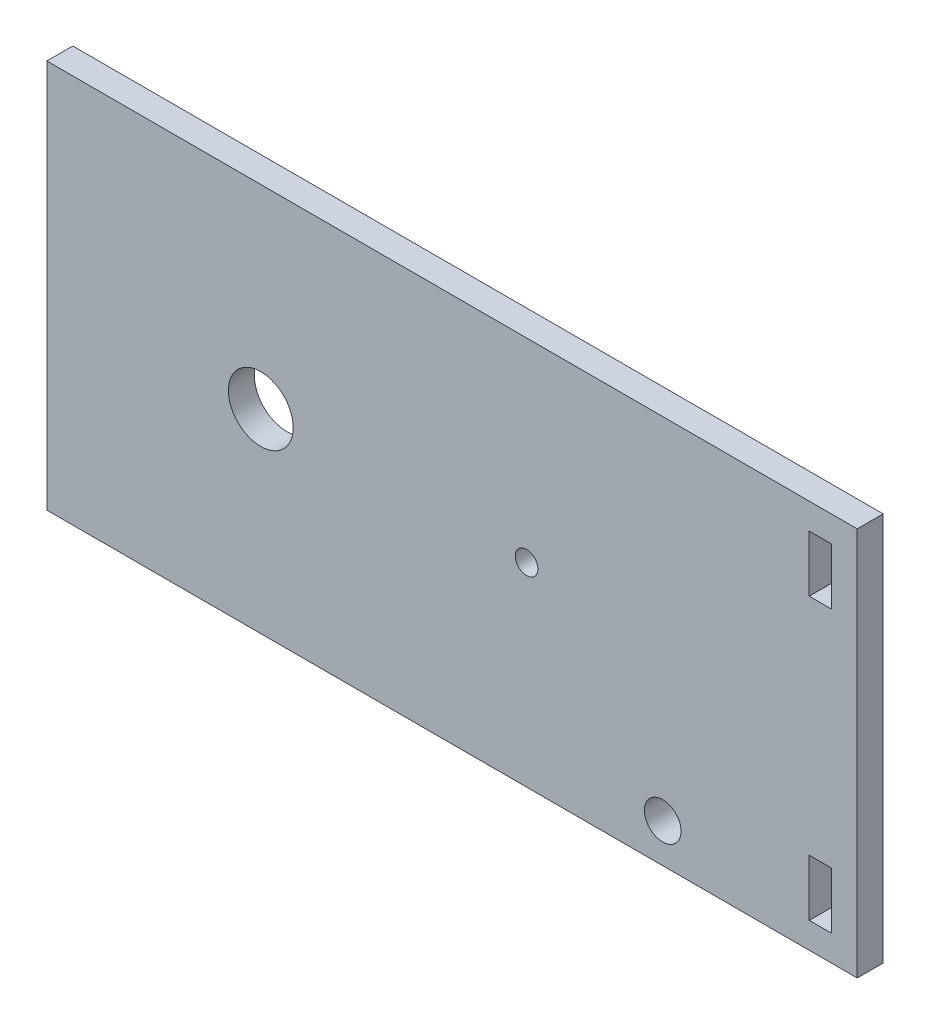
ISO-10303-21;
HEADER;
FILE_DESCRIPTION(('STEP AP214'),'2;1');
FILE_NAME('part.step','',(''),(''),'','','');
FILE_SCHEMA(('AUTOMOTIVE_DESIGN { 1 0 10303 214 1 1 1 1 }'));
ENDSEC;
DATA;
#1=APPLICATION_CONTEXT('core data for automotive mechanical design processes');
#2=APPLICATION_PROTOCOL_DEFINITION('international standard','automotive_design',2000,#1);
#3=PRODUCT_CONTEXT('',#1,'mechanical');
#4=PRODUCT('Part','Part','',(#3));
#5=PRODUCT_RELATED_PRODUCT_CATEGORY('part','',(#4));
#6=PRODUCT_DEFINITION_FORMATION('','',#4);
#7=PRODUCT_DEFINITION_CONTEXT('part definition',#1,'design');
#8=PRODUCT_DEFINITION('design','',#6,#7);
#9=PRODUCT_DEFINITION_SHAPE('','',#8);
#10=(LENGTH_UNIT() NAMED_UNIT(*) SI_UNIT(.MILLI.,.METRE.));
#11=(NAMED_UNIT(*) PLANE_ANGLE_UNIT() SI_UNIT($,.RADIAN.));
#12=(NAMED_UNIT(*) SI_UNIT($,.STERADIAN.) SOLID_ANGLE_UNIT());
#13=UNCERTAINTY_MEASURE_WITH_UNIT(LENGTH_MEASURE(1.E-05),#10,'distance_accuracy_value','');
#14=(GEOMETRIC_REPRESENTATION_CONTEXT(3) GLOBAL_UNCERTAINTY_ASSIGNED_CONTEXT((#13)) GLOBAL_UNIT_ASSIGNED_CONTEXT((#10,
#11,#12)) REPRESENTATION_CONTEXT('',''));
#15=CARTESIAN_POINT('',(0.,0.,0.));
#16=DIRECTION('',(0.,0.,1.));
#17=DIRECTION('',(1.,0.,0.));
#18=AXIS2_PLACEMENT_3D('',#15,#16,#17);
#19=CARTESIAN_POINT('',(0.,0.,4.));
#20=DIRECTION('',(0.,0.,1.));
#21=DIRECTION('',(1.,0.,0.));
#22=AXIS2_PLACEMENT_3D('',#19,#20,#21);
#23=PLANE('',#22);
#24=DIRECTION('',(-1.,0.,0.));
#25=VECTOR('',#24,1.);
#26=CARTESIAN_POINT('',(40.,26.,4.));
#27=LINE('',#26,#25);
#28=CARTESIAN_POINT('',(40.,26.,4.));
#29=VERTEX_POINT('',#28);
#30=CARTESIAN_POINT('',(36.6,26.,4.));
#31=VERTEX_POINT('',#30);
#32=EDGE_CURVE('E132',#29,#31,#27,.T.);
#33=ORIENTED_EDGE('',*,*,#32,.F.);
#34=DIRECTION('',(0.,1.,0.));
#35=VECTOR('',#34,1.);
#36=CARTESIAN_POINT('',(40.,26.,4.));
#37=LINE('',#36,#35);
#38=CARTESIAN_POINT('',(40.,17.3,4.));
#39=VERTEX_POINT('',#38);
#40=EDGE_CURVE('E123',#39,#29,#37,.T.);
#41=ORIENTED_EDGE('',*,*,#40,.F.);
#42=DIRECTION('',(1.,0.,0.));
#43=VECTOR('',#42,1.);
#44=CARTESIAN_POINT('',(40.,17.3,4.));
#45=LINE('',#44,#43);
#46=CARTESIAN_POINT('',(36.6,17.3,4.));
#47=VERTEX_POINT('',#46);
#48=EDGE_CURVE('E147',#47,#39,#45,.T.);
#49=ORIENTED_EDGE('',*,*,#48,.F.);
#50=DIRECTION('',(0.,-1.,0.));
#51=VECTOR('',#50,1.);
#52=CARTESIAN_POINT('',(36.6,26.,4.));
#53=LINE('',#52,#51);
#54=EDGE_CURVE('E145',#31,#47,#53,.T.);
#55=ORIENTED_EDGE('',*,*,#54,.F.);
#56=EDGE_LOOP('',(#33,#41,#49,#55));
#57=FACE_BOUND('',#56,.T.);
#58=DIRECTION('',(-1.,0.,0.));
#59=VECTOR('',#58,1.);
#60=CARTESIAN_POINT('',(40.,-17.3,4.));
#61=LINE('',#60,#59);
#62=CARTESIAN_POINT('',(40.,-17.3,4.));
#63=VERTEX_POINT('',#62);
#64=CARTESIAN_POINT('',(36.6,-17.3,4.));
#65=VERTEX_POINT('',#64);
#66=EDGE_CURVE('E157',#63,#65,#61,.T.);
#67=ORIENTED_EDGE('',*,*,#66,.F.);
#68=DIRECTION('',(0.,1.,0.));
#69=VECTOR('',#68,1.);
#70=CARTESIAN_POINT('',(40.,-17.3,4.));
#71=LINE('',#70,#69);
#72=CARTESIAN_POINT('',(40.,-26.,4.));
#73=VERTEX_POINT('',#72);
#74=EDGE_CURVE('E155',#73,#63,#71,.T.);
#75=ORIENTED_EDGE('',*,*,#74,.F.);
#76=DIRECTION('',(1.,0.,0.));
#77=VECTOR('',#76,1.);
#78=CARTESIAN_POINT('',(40.,-26.,4.));
#79=LINE('',#78,#77);
#80=CARTESIAN_POINT('',(36.6,-26.,4.));
#81=VERTEX_POINT('',#80);
#82=EDGE_CURVE('E161',#81,#73,#79,.T.);
#83=ORIENTED_EDGE('',*,*,#82,.F.);
#84=DIRECTION('',(0.,-1.,0.));
#85=VECTOR('',#84,1.);
#86=CARTESIAN_POINT('',(36.6,-17.3,4.));
#87=LINE('',#86,#85);
#88=EDGE_CURVE('E159',#65,#81,#87,.T.);
#89=ORIENTED_EDGE('',*,*,#88,.F.);
#90=EDGE_LOOP('',(#67,#75,#83,#89));
#91=FACE_BOUND('',#90,.T.);
#92=CARTESIAN_POINT('',(-48.,0.,4.));
#93=DIRECTION('',(0.,0.,1.));
#94=DIRECTION('',(1.,0.,0.));
#95=AXIS2_PLACEMENT_3D('',#92,#93,#94);
#96=CIRCLE('',#95,5.);
#97=CARTESIAN_POINT('',(-43.,0.,4.));
#98=VERTEX_POINT('',#97);
#99=EDGE_CURVE('E184',#98,#98,#96,.T.);
#100=ORIENTED_EDGE('',*,*,#99,.F.);
#101=EDGE_LOOP('',(#100));
#102=FACE_BOUND('',#101,.T.);
#103=DIRECTION('',(1.,0.,0.));
#104=VECTOR('',#103,1.);
#105=CARTESIAN_POINT('',(-81.,-30.,4.));
#106=LINE('',#105,#104);
#107=CARTESIAN_POINT('',(-81.,-30.,4.));
#108=VERTEX_POINT('',#107);
#109=CARTESIAN_POINT('',(44.,-30.,4.));
#110=VERTEX_POINT('',#109);
#111=EDGE_CURVE('E201',#108,#110,#106,.T.);
#112=ORIENTED_EDGE('',*,*,#111,.T.);
#113=DIRECTION('',(0.,1.,0.));
#114=VECTOR('',#113,1.);
#115=CARTESIAN_POINT('',(44.,-30.,4.));
#116=LINE('',#115,#114);
#117=CARTESIAN_POINT('',(44.,30.,4.));
#118=VERTEX_POINT('',#117);
#119=EDGE_CURVE('E171',#110,#118,#116,.T.);
#120=ORIENTED_EDGE('',*,*,#119,.T.);
#121=DIRECTION('',(-1.,0.,0.));
#122=VECTOR('',#121,1.);
#123=CARTESIAN_POINT('',(-81.,30.,4.));
#124=LINE('',#123,#122);
#125=CARTESIAN_POINT('',(-81.,30.,4.));
#126=VERTEX_POINT('',#125);
#127=EDGE_CURVE('E196',#118,#126,#124,.T.);
#128=ORIENTED_EDGE('',*,*,#127,.T.);
#129=DIRECTION('',(0.,-1.,0.));
#130=VECTOR('',#129,1.);
#131=CARTESIAN_POINT('',(-81.,-30.,4.));
#132=LINE('',#131,#130);
#133=EDGE_CURVE('E198',#126,#108,#132,.T.);
#134=ORIENTED_EDGE('',*,*,#133,.T.);
#135=EDGE_LOOP('',(#112,#120,#128,#134));
#136=FACE_BOUND('',#135,.T.);
#137=CARTESIAN_POINT('',(14.,-24.,4.));
#138=DIRECTION('',(0.,0.,1.));
#139=DIRECTION('',(1.,0.,0.));
#140=AXIS2_PLACEMENT_3D('',#137,#138,#139);
#141=CIRCLE('',#140,2.83);
#142=CARTESIAN_POINT('',(16.83,-24.,4.));
#143=VERTEX_POINT('',#142);
#144=EDGE_CURVE('E190',#143,#143,#141,.T.);
#145=ORIENTED_EDGE('',*,*,#144,.F.);
#146=EDGE_LOOP('',(#145));
#147=FACE_BOUND('',#146,.T.);
#148=CARTESIAN_POINT('',(-6.99999999999999,0.,4.));
#149=DIRECTION('',(0.,0.,1.));
#150=DIRECTION('',(1.,0.,0.));
#151=AXIS2_PLACEMENT_3D('',#148,#149,#150);
#152=CIRCLE('',#151,1.75);
#153=CARTESIAN_POINT('',(-5.24999999999999,0.,4.));
#154=VERTEX_POINT('',#153);
#155=EDGE_CURVE('E140',#154,#154,#152,.T.);
#156=ORIENTED_EDGE('',*,*,#155,.F.);
#157=EDGE_LOOP('',(#156));
#158=FACE_BOUND('',#157,.T.);
#159=ADVANCED_FACE('F32',(#57,#91,#102,#136,#147,#158),#23,.T.);
#160=CARTESIAN_POINT('',(0.,0.,0.));
#161=DIRECTION('',(0.,0.,1.));
#162=DIRECTION('',(1.,0.,0.));
#163=AXIS2_PLACEMENT_3D('',#160,#161,#162);
#164=PLANE('',#163);
#165=DIRECTION('',(0.,-1.,0.));
#166=VECTOR('',#165,1.);
#167=CARTESIAN_POINT('',(40.,0.,0.));
#168=LINE('',#167,#166);
#169=CARTESIAN_POINT('',(40.,-17.3,0.));
#170=VERTEX_POINT('',#169);
#171=CARTESIAN_POINT('',(40.,-26.,0.));
#172=VERTEX_POINT('',#171);
#173=EDGE_CURVE('E219',#170,#172,#168,.T.);
#174=ORIENTED_EDGE('',*,*,#173,.F.);
#175=DIRECTION('',(1.,0.,0.));
#176=VECTOR('',#175,1.);
#177=CARTESIAN_POINT('',(0.,-17.3,0.));
#178=LINE('',#177,#176);
#179=CARTESIAN_POINT('',(36.6,-17.3,0.));
#180=VERTEX_POINT('',#179);
#181=EDGE_CURVE('E217',#180,#170,#178,.T.);
#182=ORIENTED_EDGE('',*,*,#181,.F.);
#183=DIRECTION('',(0.,1.,0.));
#184=VECTOR('',#183,1.);
#185=CARTESIAN_POINT('',(36.6,0.,0.));
#186=LINE('',#185,#184);
#187=CARTESIAN_POINT('',(36.6,-26.,0.));
#188=VERTEX_POINT('',#187);
#189=EDGE_CURVE('E215',#188,#180,#186,.T.);
#190=ORIENTED_EDGE('',*,*,#189,.F.);
#191=DIRECTION('',(-1.,0.,0.));
#192=VECTOR('',#191,1.);
#193=CARTESIAN_POINT('',(0.,-26.,0.));
#194=LINE('',#193,#192);
#195=EDGE_CURVE('E213',#172,#188,#194,.T.);
#196=ORIENTED_EDGE('',*,*,#195,.F.);
#197=EDGE_LOOP('',(#174,#182,#190,#196));
#198=FACE_BOUND('',#197,.T.);
#199=DIRECTION('',(-1.,0.,0.));
#200=VECTOR('',#199,1.);
#201=CARTESIAN_POINT('',(-81.,30.,0.));
#202=LINE('',#201,#200);
#203=CARTESIAN_POINT('',(44.,30.,0.));
#204=VERTEX_POINT('',#203);
#205=CARTESIAN_POINT('',(-81.,30.,0.));
#206=VERTEX_POINT('',#205);
#207=EDGE_CURVE('E193',#204,#206,#202,.T.);
#208=ORIENTED_EDGE('',*,*,#207,.F.);
#209=DIRECTION('',(0.,1.,0.));
#210=VECTOR('',#209,1.);
#211=CARTESIAN_POINT('',(44.,-30.,0.));
#212=LINE('',#211,#210);
#213=CARTESIAN_POINT('',(44.,-30.,0.));
#214=VERTEX_POINT('',#213);
#215=EDGE_CURVE('E175',#214,#204,#212,.T.);
#216=ORIENTED_EDGE('',*,*,#215,.F.);
#217=DIRECTION('',(1.,0.,0.));
#218=VECTOR('',#217,1.);
#219=CARTESIAN_POINT('',(-81.,-30.,0.));
#220=LINE('',#219,#218);
#221=CARTESIAN_POINT('',(-81.,-30.,0.));
#222=VERTEX_POINT('',#221);
#223=EDGE_CURVE('E199',#222,#214,#220,.T.);
#224=ORIENTED_EDGE('',*,*,#223,.F.);
#225=DIRECTION('',(0.,-1.,0.));
#226=VECTOR('',#225,1.);
#227=CARTESIAN_POINT('',(-81.,-30.,0.));
#228=LINE('',#227,#226);
#229=EDGE_CURVE('E205',#206,#222,#228,.T.);
#230=ORIENTED_EDGE('',*,*,#229,.F.);
#231=EDGE_LOOP('',(#208,#216,#224,#230));
#232=FACE_BOUND('',#231,.T.);
#233=CARTESIAN_POINT('',(14.,-24.,0.));
#234=DIRECTION('',(0.,0.,1.));
#235=DIRECTION('',(1.,0.,0.));
#236=AXIS2_PLACEMENT_3D('',#233,#234,#235);
#237=CIRCLE('',#236,2.83);
#238=CARTESIAN_POINT('',(16.83,-24.,0.));
#239=VERTEX_POINT('',#238);
#240=EDGE_CURVE('E187',#239,#239,#237,.T.);
#241=ORIENTED_EDGE('',*,*,#240,.T.);
#242=EDGE_LOOP('',(#241));
#243=FACE_BOUND('',#242,.T.);
#244=CARTESIAN_POINT('',(-48.,0.,0.));
#245=DIRECTION('',(0.,0.,1.));
#246=DIRECTION('',(1.,0.,0.));
#247=AXIS2_PLACEMENT_3D('',#244,#245,#246);
#248=CIRCLE('',#247,5.);
#249=CARTESIAN_POINT('',(-43.,0.,0.));
#250=VERTEX_POINT('',#249);
#251=EDGE_CURVE('E183',#250,#250,#248,.T.);
#252=ORIENTED_EDGE('',*,*,#251,.T.);
#253=EDGE_LOOP('',(#252));
#254=FACE_BOUND('',#253,.T.);
#255=DIRECTION('',(0.,-1.,0.));
#256=VECTOR('',#255,1.);
#257=CARTESIAN_POINT('',(40.,0.,0.));
#258=LINE('',#257,#256);
#259=CARTESIAN_POINT('',(40.,26.,0.));
#260=VERTEX_POINT('',#259);
#261=CARTESIAN_POINT('',(40.,17.3,0.));
#262=VERTEX_POINT('',#261);
#263=EDGE_CURVE('E11',#260,#262,#258,.T.);
#264=ORIENTED_EDGE('',*,*,#263,.F.);
#265=DIRECTION('',(1.,0.,0.));
#266=VECTOR('',#265,1.);
#267=CARTESIAN_POINT('',(0.,26.,0.));
#268=LINE('',#267,#266);
#269=CARTESIAN_POINT('',(36.6,26.,0.));
#270=VERTEX_POINT('',#269);
#271=EDGE_CURVE('E41',#270,#260,#268,.T.);
#272=ORIENTED_EDGE('',*,*,#271,.F.);
#273=DIRECTION('',(0.,1.,0.));
#274=VECTOR('',#273,1.);
#275=CARTESIAN_POINT('',(36.6,0.,0.));
#276=LINE('',#275,#274);
#277=CARTESIAN_POINT('',(36.6,17.3,0.));
#278=VERTEX_POINT('',#277);
#279=EDGE_CURVE('E224',#278,#270,#276,.T.);
#280=ORIENTED_EDGE('',*,*,#279,.F.);
#281=DIRECTION('',(-1.,0.,0.));
#282=VECTOR('',#281,1.);
#283=CARTESIAN_POINT('',(0.,17.3,0.));
#284=LINE('',#283,#282);
#285=EDGE_CURVE('E222',#262,#278,#284,.T.);
#286=ORIENTED_EDGE('',*,*,#285,.F.);
#287=EDGE_LOOP('',(#264,#272,#280,#286));
#288=FACE_BOUND('',#287,.T.);
#289=CARTESIAN_POINT('',(-6.99999999999999,0.,0.));
#290=DIRECTION('',(0.,0.,1.));
#291=DIRECTION('',(1.,0.,0.));
#292=AXIS2_PLACEMENT_3D('',#289,#290,#291);
#293=CIRCLE('',#292,1.75);
#294=CARTESIAN_POINT('',(-5.24999999999999,0.,0.));
#295=VERTEX_POINT('',#294);
#296=EDGE_CURVE('E36',#295,#295,#293,.F.);
#297=ORIENTED_EDGE('',*,*,#296,.F.);
#298=EDGE_LOOP('',(#297));
#299=FACE_BOUND('',#298,.T.);
#300=ADVANCED_FACE('F231',(#198,#232,#243,#254,#288,#299),#164,.F.);
#301=CARTESIAN_POINT('',(-81.,30.,4.));
#302=DIRECTION('',(0.,-1.,0.));
#303=DIRECTION('',(0.,0.,-1.));
#304=AXIS2_PLACEMENT_3D('',#301,#302,#303);
#305=PLANE('',#304);
#306=ORIENTED_EDGE('',*,*,#207,.T.);
#307=DIRECTION('',(0.,0.,-1.));
#308=VECTOR('',#307,1.);
#309=CARTESIAN_POINT('',(-81.,30.,4.));
#310=LINE('',#309,#308);
#311=EDGE_CURVE('E210',#126,#206,#310,.T.);
#312=ORIENTED_EDGE('',*,*,#311,.F.);
#313=ORIENTED_EDGE('',*,*,#127,.F.);
#314=DIRECTION('',(0.,0.,-1.));
#315=VECTOR('',#314,1.);
#316=CARTESIAN_POINT('',(44.,30.,4.));
#317=LINE('',#316,#315);
#318=EDGE_CURVE('E174',#118,#204,#317,.T.);
#319=ORIENTED_EDGE('',*,*,#318,.T.);
#320=EDGE_LOOP('',(#306,#312,#313,#319));
#321=FACE_BOUND('',#320,.T.);
#322=ADVANCED_FACE('F34',(#321),#305,.F.);
#323=CARTESIAN_POINT('',(-81.,-30.,4.));
#324=DIRECTION('',(1.,0.,0.));
#325=DIRECTION('',(0.,0.,-1.));
#326=AXIS2_PLACEMENT_3D('',#323,#324,#325);
#327=PLANE('',#326);
#328=ORIENTED_EDGE('',*,*,#229,.T.);
#329=DIRECTION('',(0.,0.,-1.));
#330=VECTOR('',#329,1.);
#331=CARTESIAN_POINT('',(-81.,-30.,4.));
#332=LINE('',#331,#330);
#333=EDGE_CURVE('E203',#108,#222,#332,.T.);
#334=ORIENTED_EDGE('',*,*,#333,.F.);
#335=ORIENTED_EDGE('',*,*,#133,.F.);
#336=ORIENTED_EDGE('',*,*,#311,.T.);
#337=EDGE_LOOP('',(#328,#334,#335,#336));
#338=FACE_BOUND('',#337,.T.);
#339=ADVANCED_FACE('F257',(#338),#327,.F.);
#340=CARTESIAN_POINT('',(-81.,-30.,4.));
#341=DIRECTION('',(0.,1.,0.));
#342=DIRECTION('',(0.,0.,1.));
#343=AXIS2_PLACEMENT_3D('',#340,#341,#342);
#344=PLANE('',#343);
#345=ORIENTED_EDGE('',*,*,#223,.T.);
#346=DIRECTION('',(0.,0.,-1.));
#347=VECTOR('',#346,1.);
#348=CARTESIAN_POINT('',(44.,-30.,4.));
#349=LINE('',#348,#347);
#350=EDGE_CURVE('E180',#110,#214,#349,.T.);
#351=ORIENTED_EDGE('',*,*,#350,.F.);
#352=ORIENTED_EDGE('',*,*,#111,.F.);
#353=ORIENTED_EDGE('',*,*,#333,.T.);
#354=EDGE_LOOP('',(#345,#351,#352,#353));
#355=FACE_BOUND('',#354,.T.);
#356=ADVANCED_FACE('F255',(#355),#344,.F.);
#357=CARTESIAN_POINT('',(14.,-24.,4.));
#358=DIRECTION('',(0.,0.,-1.));
#359=DIRECTION('',(-1.,0.,0.));
#360=AXIS2_PLACEMENT_3D('',#357,#358,#359);
#361=CYLINDRICAL_SURFACE('',#360,2.83);
#362=ORIENTED_EDGE('',*,*,#144,.T.);
#363=EDGE_LOOP('',(#362));
#364=FACE_BOUND('',#363,.T.);
#365=ORIENTED_EDGE('',*,*,#240,.F.);
#366=EDGE_LOOP('',(#365));
#367=FACE_BOUND('',#366,.T.);
#368=ADVANCED_FACE('F252',(#364,#367),#361,.F.);
#369=CARTESIAN_POINT('',(-48.,0.,4.));
#370=DIRECTION('',(0.,0.,-1.));
#371=DIRECTION('',(-1.,0.,0.));
#372=AXIS2_PLACEMENT_3D('',#369,#370,#371);
#373=CYLINDRICAL_SURFACE('',#372,5.);
#374=ORIENTED_EDGE('',*,*,#99,.T.);
#375=EDGE_LOOP('',(#374));
#376=FACE_BOUND('',#375,.T.);
#377=ORIENTED_EDGE('',*,*,#251,.F.);
#378=EDGE_LOOP('',(#377));
#379=FACE_BOUND('',#378,.T.);
#380=ADVANCED_FACE('F291',(#376,#379),#373,.F.);
#381=CARTESIAN_POINT('',(44.,-30.,4.));
#382=DIRECTION('',(-1.,0.,0.));
#383=DIRECTION('',(0.,0.,1.));
#384=AXIS2_PLACEMENT_3D('',#381,#382,#383);
#385=PLANE('',#384);
#386=ORIENTED_EDGE('',*,*,#215,.T.);
#387=ORIENTED_EDGE('',*,*,#318,.F.);
#388=ORIENTED_EDGE('',*,*,#119,.F.);
#389=ORIENTED_EDGE('',*,*,#350,.T.);
#390=EDGE_LOOP('',(#386,#387,#388,#389));
#391=FACE_BOUND('',#390,.T.);
#392=ADVANCED_FACE('F277',(#391),#385,.F.);
#393=CARTESIAN_POINT('',(40.,-17.3,4.));
#394=DIRECTION('',(-1.,0.,0.));
#395=DIRECTION('',(0.,0.,1.));
#396=AXIS2_PLACEMENT_3D('',#393,#394,#395);
#397=PLANE('',#396);
#398=ORIENTED_EDGE('',*,*,#173,.T.);
#399=DIRECTION('',(0.,0.,-1.));
#400=VECTOR('',#399,1.);
#401=CARTESIAN_POINT('',(40.,-26.,4.));
#402=LINE('',#401,#400);
#403=EDGE_CURVE('E163',#73,#172,#402,.T.);
#404=ORIENTED_EDGE('',*,*,#403,.F.);
#405=ORIENTED_EDGE('',*,*,#74,.T.);
#406=DIRECTION('',(0.,0.,-1.));
#407=VECTOR('',#406,1.);
#408=CARTESIAN_POINT('',(40.,-17.3,4.));
#409=LINE('',#408,#407);
#410=EDGE_CURVE('E133',#63,#170,#409,.T.);
#411=ORIENTED_EDGE('',*,*,#410,.T.);
#412=EDGE_LOOP('',(#398,#404,#405,#411));
#413=FACE_BOUND('',#412,.T.);
#414=ADVANCED_FACE('F301',(#413),#397,.T.);
#415=CARTESIAN_POINT('',(40.,-17.3,4.));
#416=DIRECTION('',(0.,-1.,0.));
#417=DIRECTION('',(1.,0.,0.));
#418=AXIS2_PLACEMENT_3D('',#415,#416,#417);
#419=PLANE('',#418);
#420=ORIENTED_EDGE('',*,*,#181,.T.);
#421=ORIENTED_EDGE('',*,*,#410,.F.);
#422=ORIENTED_EDGE('',*,*,#66,.T.);
#423=DIRECTION('',(0.,0.,-1.));
#424=VECTOR('',#423,1.);
#425=CARTESIAN_POINT('',(36.6,-17.3,4.));
#426=LINE('',#425,#424);
#427=EDGE_CURVE('E166',#65,#180,#426,.T.);
#428=ORIENTED_EDGE('',*,*,#427,.T.);
#429=EDGE_LOOP('',(#420,#421,#422,#428));
#430=FACE_BOUND('',#429,.T.);
#431=ADVANCED_FACE('F306',(#430),#419,.T.);
#432=CARTESIAN_POINT('',(36.6,-17.3,4.));
#433=DIRECTION('',(1.,0.,0.));
#434=DIRECTION('',(0.,0.,-1.));
#435=AXIS2_PLACEMENT_3D('',#432,#433,#434);
#436=PLANE('',#435);
#437=ORIENTED_EDGE('',*,*,#189,.T.);
#438=ORIENTED_EDGE('',*,*,#427,.F.);
#439=ORIENTED_EDGE('',*,*,#88,.T.);
#440=DIRECTION('',(0.,0.,-1.));
#441=VECTOR('',#440,1.);
#442=CARTESIAN_POINT('',(36.6,-26.,4.));
#443=LINE('',#442,#441);
#444=EDGE_CURVE('E56',#81,#188,#443,.T.);
#445=ORIENTED_EDGE('',*,*,#444,.T.);
#446=EDGE_LOOP('',(#437,#438,#439,#445));
#447=FACE_BOUND('',#446,.T.);
#448=ADVANCED_FACE('F310',(#447),#436,.T.);
#449=CARTESIAN_POINT('',(40.,-26.,4.));
#450=DIRECTION('',(0.,1.,0.));
#451=DIRECTION('',(-1.,0.,0.));
#452=AXIS2_PLACEMENT_3D('',#449,#450,#451);
#453=PLANE('',#452);
#454=ORIENTED_EDGE('',*,*,#195,.T.);
#455=ORIENTED_EDGE('',*,*,#444,.F.);
#456=ORIENTED_EDGE('',*,*,#82,.T.);
#457=ORIENTED_EDGE('',*,*,#403,.T.);
#458=EDGE_LOOP('',(#454,#455,#456,#457));
#459=FACE_BOUND('',#458,.T.);
#460=ADVANCED_FACE('F314',(#459),#453,.T.);
#461=CARTESIAN_POINT('',(40.,26.,4.));
#462=DIRECTION('',(-1.,0.,0.));
#463=DIRECTION('',(0.,0.,1.));
#464=AXIS2_PLACEMENT_3D('',#461,#462,#463);
#465=PLANE('',#464);
#466=ORIENTED_EDGE('',*,*,#263,.T.);
#467=DIRECTION('',(0.,0.,-1.));
#468=VECTOR('',#467,1.);
#469=CARTESIAN_POINT('',(40.,17.3,4.));
#470=LINE('',#469,#468);
#471=EDGE_CURVE('E128',#39,#262,#470,.T.);
#472=ORIENTED_EDGE('',*,*,#471,.F.);
#473=ORIENTED_EDGE('',*,*,#40,.T.);
#474=DIRECTION('',(0.,0.,-1.));
#475=VECTOR('',#474,1.);
#476=CARTESIAN_POINT('',(40.,26.,4.));
#477=LINE('',#476,#475);
#478=EDGE_CURVE('E126',#29,#260,#477,.T.);
#479=ORIENTED_EDGE('',*,*,#478,.T.);
#480=EDGE_LOOP('',(#466,#472,#473,#479));
#481=FACE_BOUND('',#480,.T.);
#482=ADVANCED_FACE('F125',(#481),#465,.T.);
#483=CARTESIAN_POINT('',(40.,26.,4.));
#484=DIRECTION('',(0.,-1.,0.));
#485=DIRECTION('',(0.,0.,-1.));
#486=AXIS2_PLACEMENT_3D('',#483,#484,#485);
#487=PLANE('',#486);
#488=ORIENTED_EDGE('',*,*,#271,.T.);
#489=ORIENTED_EDGE('',*,*,#478,.F.);
#490=ORIENTED_EDGE('',*,*,#32,.T.);
#491=DIRECTION('',(0.,0.,-1.));
#492=VECTOR('',#491,1.);
#493=CARTESIAN_POINT('',(36.6,26.,4.));
#494=LINE('',#493,#492);
#495=EDGE_CURVE('E141',#31,#270,#494,.T.);
#496=ORIENTED_EDGE('',*,*,#495,.T.);
#497=EDGE_LOOP('',(#488,#489,#490,#496));
#498=FACE_BOUND('',#497,.T.);
#499=ADVANCED_FACE('F136',(#498),#487,.T.);
#500=CARTESIAN_POINT('',(36.6,26.,4.));
#501=DIRECTION('',(1.,0.,0.));
#502=DIRECTION('',(0.,0.,-1.));
#503=AXIS2_PLACEMENT_3D('',#500,#501,#502);
#504=PLANE('',#503);
#505=ORIENTED_EDGE('',*,*,#279,.T.);
#506=ORIENTED_EDGE('',*,*,#495,.F.);
#507=ORIENTED_EDGE('',*,*,#54,.T.);
#508=DIRECTION('',(0.,0.,-1.));
#509=VECTOR('',#508,1.);
#510=CARTESIAN_POINT('',(36.6,17.3,4.));
#511=LINE('',#510,#509);
#512=EDGE_CURVE('E48',#47,#278,#511,.T.);
#513=ORIENTED_EDGE('',*,*,#512,.T.);
#514=EDGE_LOOP('',(#505,#506,#507,#513));
#515=FACE_BOUND('',#514,.T.);
#516=ADVANCED_FACE('F228',(#515),#504,.T.);
#517=CARTESIAN_POINT('',(40.,17.3,4.));
#518=DIRECTION('',(0.,1.,0.));
#519=DIRECTION('',(0.,0.,1.));
#520=AXIS2_PLACEMENT_3D('',#517,#518,#519);
#521=PLANE('',#520);
#522=ORIENTED_EDGE('',*,*,#285,.T.);
#523=ORIENTED_EDGE('',*,*,#512,.F.);
#524=ORIENTED_EDGE('',*,*,#48,.T.);
#525=ORIENTED_EDGE('',*,*,#471,.T.);
#526=EDGE_LOOP('',(#522,#523,#524,#525));
#527=FACE_BOUND('',#526,.T.);
#528=ADVANCED_FACE('F233',(#527),#521,.T.);
#529=CARTESIAN_POINT('',(-6.99999999999999,0.,4.));
#530=DIRECTION('',(0.,0.,-1.));
#531=DIRECTION('',(-1.,0.,0.));
#532=AXIS2_PLACEMENT_3D('',#529,#530,#531);
#533=CYLINDRICAL_SURFACE('',#532,1.75);
#534=ORIENTED_EDGE('',*,*,#155,.T.);
#535=EDGE_LOOP('',(#534));
#536=FACE_BOUND('',#535,.T.);
#537=ORIENTED_EDGE('',*,*,#296,.T.);
#538=EDGE_LOOP('',(#537));
#539=FACE_BOUND('',#538,.T.);
#540=ADVANCED_FACE('F235',(#536,#539),#533,.F.);
#541=CLOSED_SHELL('',(#159,#300,#322,#339,#356,#368,#380,#392,#414,#431,#448,#460,#482,#499,
#516,#528,#540));
#542=MANIFOLD_SOLID_BREP('B2',#541);
#543=ADVANCED_BREP_SHAPE_REPRESENTATION('',(#18,#542),#14);
#544=SHAPE_DEFINITION_REPRESENTATION(#9,#543);
ENDSEC;
END-ISO-10303-21;
